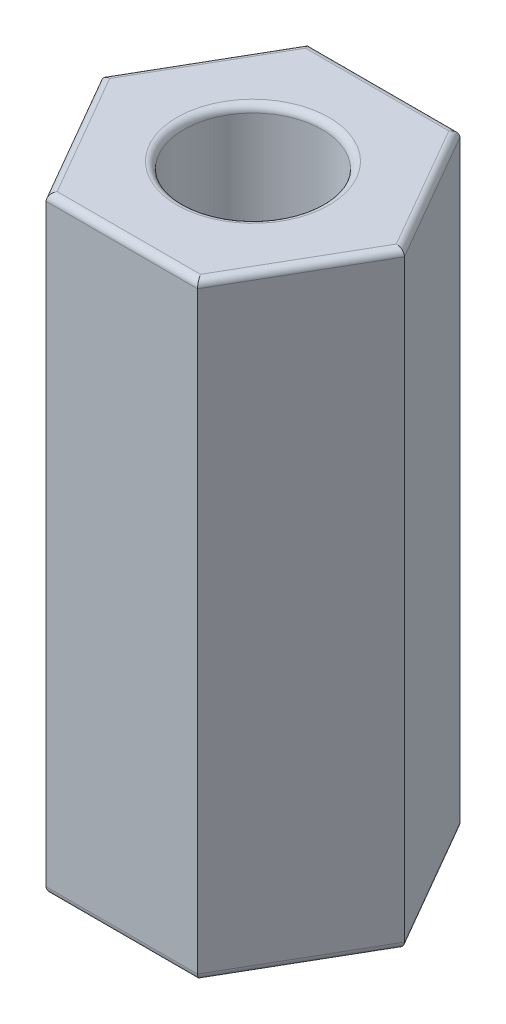
ISO-10303-21;
HEADER;
FILE_DESCRIPTION(('STEP AP214'),'2;1');
FILE_NAME('part.step','',(''),(''),'','','');
FILE_SCHEMA(('AUTOMOTIVE_DESIGN { 1 0 10303 214 1 1 1 1 }'));
ENDSEC;
DATA;
#1=APPLICATION_CONTEXT('core data for automotive mechanical design processes');
#2=APPLICATION_PROTOCOL_DEFINITION('international standard','automotive_design',2000,#1);
#3=PRODUCT_CONTEXT('',#1,'mechanical');
#4=PRODUCT('Part','Part','',(#3));
#5=PRODUCT_RELATED_PRODUCT_CATEGORY('part','',(#4));
#6=PRODUCT_DEFINITION_FORMATION('','',#4);
#7=PRODUCT_DEFINITION_CONTEXT('part definition',#1,'design');
#8=PRODUCT_DEFINITION('design','',#6,#7);
#9=PRODUCT_DEFINITION_SHAPE('','',#8);
#10=(LENGTH_UNIT() NAMED_UNIT(*) SI_UNIT(.MILLI.,.METRE.));
#11=(NAMED_UNIT(*) PLANE_ANGLE_UNIT() SI_UNIT($,.RADIAN.));
#12=(NAMED_UNIT(*) SI_UNIT($,.STERADIAN.) SOLID_ANGLE_UNIT());
#13=UNCERTAINTY_MEASURE_WITH_UNIT(LENGTH_MEASURE(1.E-05),#10,'distance_accuracy_value','');
#14=(GEOMETRIC_REPRESENTATION_CONTEXT(3) GLOBAL_UNCERTAINTY_ASSIGNED_CONTEXT((#13)) GLOBAL_UNIT_ASSIGNED_CONTEXT((#10,
#11,#12)) REPRESENTATION_CONTEXT('',''));
#15=CARTESIAN_POINT('',(0.,0.,0.));
#16=DIRECTION('',(0.,0.,1.));
#17=DIRECTION('',(1.,0.,0.));
#18=AXIS2_PLACEMENT_3D('',#15,#16,#17);
#19=CARTESIAN_POINT('',(1.37114915429844,5.5,2.37490000000001));
#20=DIRECTION('',(-0.866025403784439,0.,-0.5));
#21=DIRECTION('',(-0.5,0.,0.866025403784439));
#22=AXIS2_PLACEMENT_3D('',#19,#20,#21);
#23=PLANE('',#22);
#24=DIRECTION('',(0.,-1.,0.));
#25=VECTOR('',#24,1.);
#26=CARTESIAN_POINT('',(2.74229830859688,5.5,0.));
#27=LINE('',#26,#25);
#28=CARTESIAN_POINT('',(2.74229830859688,5.373,0.));
#29=VERTEX_POINT('',#28);
#30=CARTESIAN_POINT('',(2.74229830859688,-5.373,0.));
#31=VERTEX_POINT('',#30);
#32=EDGE_CURVE('E246',#29,#31,#27,.T.);
#33=ORIENTED_EDGE('',*,*,#32,.F.);
#34=DIRECTION('',(0.5,0.,-0.866025403784439));
#35=VECTOR('',#34,1.);
#36=CARTESIAN_POINT('',(1.37114915429844,5.373,2.37490000000001));
#37=LINE('',#36,#35);
#38=CARTESIAN_POINT('',(1.37114915429844,5.373,2.37490000000001));
#39=VERTEX_POINT('',#38);
#40=EDGE_CURVE('E178',#29,#39,#37,.F.);
#41=ORIENTED_EDGE('',*,*,#40,.T.);
#42=DIRECTION('',(0.,-1.,0.));
#43=VECTOR('',#42,1.);
#44=CARTESIAN_POINT('',(1.37114915429844,5.5,2.37490000000001));
#45=LINE('',#44,#43);
#46=CARTESIAN_POINT('',(1.37114915429844,-5.373,2.37490000000001));
#47=VERTEX_POINT('',#46);
#48=EDGE_CURVE('E208',#39,#47,#45,.T.);
#49=ORIENTED_EDGE('',*,*,#48,.T.);
#50=DIRECTION('',(0.5,0.,-0.866025403784439));
#51=VECTOR('',#50,1.);
#52=CARTESIAN_POINT('',(1.37114915429844,-5.373,2.37490000000001));
#53=LINE('',#52,#51);
#54=EDGE_CURVE('E176',#47,#31,#53,.T.);
#55=ORIENTED_EDGE('',*,*,#54,.T.);
#56=EDGE_LOOP('',(#33,#41,#49,#55));
#57=FACE_BOUND('',#56,.T.);
#58=ADVANCED_FACE('F35',(#57),#23,.F.);
#59=CARTESIAN_POINT('',(2.74229830859688,5.5,0.));
#60=DIRECTION('',(-0.866025403784439,0.,0.5));
#61=DIRECTION('',(0.5,0.,0.866025403784439));
#62=AXIS2_PLACEMENT_3D('',#59,#60,#61);
#63=PLANE('',#62);
#64=DIRECTION('',(0.,-1.,0.));
#65=VECTOR('',#64,1.);
#66=CARTESIAN_POINT('',(1.37114915429844,5.5,-2.37490000000001));
#67=LINE('',#66,#65);
#68=CARTESIAN_POINT('',(1.37114915429844,5.373,-2.37490000000001));
#69=VERTEX_POINT('',#68);
#70=CARTESIAN_POINT('',(1.37114915429844,-5.373,-2.37490000000001));
#71=VERTEX_POINT('',#70);
#72=EDGE_CURVE('E253',#69,#71,#67,.T.);
#73=ORIENTED_EDGE('',*,*,#72,.F.);
#74=DIRECTION('',(-0.5,0.,-0.866025403784439));
#75=VECTOR('',#74,1.);
#76=CARTESIAN_POINT('',(2.74229830859688,5.373,0.));
#77=LINE('',#76,#75);
#78=EDGE_CURVE('E174',#69,#29,#77,.F.);
#79=ORIENTED_EDGE('',*,*,#78,.T.);
#80=ORIENTED_EDGE('',*,*,#32,.T.);
#81=DIRECTION('',(-0.5,0.,-0.866025403784439));
#82=VECTOR('',#81,1.);
#83=CARTESIAN_POINT('',(2.74229830859688,-5.373,0.));
#84=LINE('',#83,#82);
#85=EDGE_CURVE('E171',#31,#71,#84,.T.);
#86=ORIENTED_EDGE('',*,*,#85,.T.);
#87=EDGE_LOOP('',(#73,#79,#80,#86));
#88=FACE_BOUND('',#87,.T.);
#89=ADVANCED_FACE('F250',(#88),#63,.F.);
#90=CARTESIAN_POINT('',(1.37114915429844,5.5,-2.37490000000001));
#91=DIRECTION('',(0.,0.,1.));
#92=DIRECTION('',(1.,0.,0.));
#93=AXIS2_PLACEMENT_3D('',#90,#91,#92);
#94=PLANE('',#93);
#95=DIRECTION('',(0.,-1.,0.));
#96=VECTOR('',#95,1.);
#97=CARTESIAN_POINT('',(-1.37114915429844,5.5,-2.37490000000001));
#98=LINE('',#97,#96);
#99=CARTESIAN_POINT('',(-1.37114915429844,5.373,-2.37490000000001));
#100=VERTEX_POINT('',#99);
#101=CARTESIAN_POINT('',(-1.37114915429844,-5.373,-2.37490000000001));
#102=VERTEX_POINT('',#101);
#103=EDGE_CURVE('E257',#100,#102,#98,.T.);
#104=ORIENTED_EDGE('',*,*,#103,.F.);
#105=DIRECTION('',(-1.,0.,0.));
#106=VECTOR('',#105,1.);
#107=CARTESIAN_POINT('',(1.37114915429844,5.373,-2.37490000000001));
#108=LINE('',#107,#106);
#109=EDGE_CURVE('E169',#100,#69,#108,.F.);
#110=ORIENTED_EDGE('',*,*,#109,.T.);
#111=ORIENTED_EDGE('',*,*,#72,.T.);
#112=DIRECTION('',(-1.,0.,0.));
#113=VECTOR('',#112,1.);
#114=CARTESIAN_POINT('',(1.37114915429844,-5.373,-2.37490000000001));
#115=LINE('',#114,#113);
#116=EDGE_CURVE('E167',#71,#102,#115,.T.);
#117=ORIENTED_EDGE('',*,*,#116,.T.);
#118=EDGE_LOOP('',(#104,#110,#111,#117));
#119=FACE_BOUND('',#118,.T.);
#120=ADVANCED_FACE('F313',(#119),#94,.F.);
#121=CARTESIAN_POINT('',(-1.37114915429844,5.5,-2.37490000000001));
#122=DIRECTION('',(0.866025403784438,0.,0.5));
#123=DIRECTION('',(0.5,0.,-0.866025403784439));
#124=AXIS2_PLACEMENT_3D('',#121,#122,#123);
#125=PLANE('',#124);
#126=DIRECTION('',(0.,-1.,0.));
#127=VECTOR('',#126,1.);
#128=CARTESIAN_POINT('',(-2.74229830859689,5.5,0.));
#129=LINE('',#128,#127);
#130=CARTESIAN_POINT('',(-2.74229830859689,5.373,0.));
#131=VERTEX_POINT('',#130);
#132=CARTESIAN_POINT('',(-2.74229830859689,-5.373,0.));
#133=VERTEX_POINT('',#132);
#134=EDGE_CURVE('E282',#131,#133,#129,.T.);
#135=ORIENTED_EDGE('',*,*,#134,.F.);
#136=DIRECTION('',(-0.5,0.,0.866025403784439));
#137=VECTOR('',#136,1.);
#138=CARTESIAN_POINT('',(-1.37114915429844,5.373,-2.37490000000001));
#139=LINE('',#138,#137);
#140=EDGE_CURVE('E165',#131,#100,#139,.F.);
#141=ORIENTED_EDGE('',*,*,#140,.T.);
#142=ORIENTED_EDGE('',*,*,#103,.T.);
#143=DIRECTION('',(-0.5,0.,0.866025403784439));
#144=VECTOR('',#143,1.);
#145=CARTESIAN_POINT('',(-1.37114915429844,-5.373,-2.37490000000001));
#146=LINE('',#145,#144);
#147=EDGE_CURVE('E163',#102,#133,#146,.T.);
#148=ORIENTED_EDGE('',*,*,#147,.T.);
#149=EDGE_LOOP('',(#135,#141,#142,#148));
#150=FACE_BOUND('',#149,.T.);
#151=ADVANCED_FACE('F289',(#150),#125,.F.);
#152=CARTESIAN_POINT('',(-2.74229830859689,5.5,0.));
#153=DIRECTION('',(0.866025403784439,0.,-0.5));
#154=DIRECTION('',(-0.5,0.,-0.866025403784439));
#155=AXIS2_PLACEMENT_3D('',#152,#153,#154);
#156=PLANE('',#155);
#157=DIRECTION('',(0.,-1.,0.));
#158=VECTOR('',#157,1.);
#159=CARTESIAN_POINT('',(-1.37114915429845,5.5,2.37490000000001));
#160=LINE('',#159,#158);
#161=CARTESIAN_POINT('',(-1.37114915429845,5.373,2.37490000000001));
#162=VERTEX_POINT('',#161);
#163=CARTESIAN_POINT('',(-1.37114915429845,-5.373,2.37490000000001));
#164=VERTEX_POINT('',#163);
#165=EDGE_CURVE('E280',#162,#164,#160,.T.);
#166=ORIENTED_EDGE('',*,*,#165,.F.);
#167=DIRECTION('',(0.5,0.,0.866025403784439));
#168=VECTOR('',#167,1.);
#169=CARTESIAN_POINT('',(-2.74229830859689,5.373,0.));
#170=LINE('',#169,#168);
#171=EDGE_CURVE('E161',#162,#131,#170,.F.);
#172=ORIENTED_EDGE('',*,*,#171,.T.);
#173=ORIENTED_EDGE('',*,*,#134,.T.);
#174=DIRECTION('',(0.5,0.,0.866025403784439));
#175=VECTOR('',#174,1.);
#176=CARTESIAN_POINT('',(-2.74229830859689,-5.373,0.));
#177=LINE('',#176,#175);
#178=EDGE_CURVE('E159',#133,#164,#177,.T.);
#179=ORIENTED_EDGE('',*,*,#178,.T.);
#180=EDGE_LOOP('',(#166,#172,#173,#179));
#181=FACE_BOUND('',#180,.T.);
#182=ADVANCED_FACE('F281',(#181),#156,.F.);
#183=CARTESIAN_POINT('',(-1.37114915429845,5.5,2.37490000000001));
#184=DIRECTION('',(0.,0.,-1.));
#185=DIRECTION('',(-1.,0.,0.));
#186=AXIS2_PLACEMENT_3D('',#183,#184,#185);
#187=PLANE('',#186);
#188=ORIENTED_EDGE('',*,*,#48,.F.);
#189=DIRECTION('',(1.,0.,0.));
#190=VECTOR('',#189,1.);
#191=CARTESIAN_POINT('',(-1.37114915429845,5.373,2.37490000000001));
#192=LINE('',#191,#190);
#193=EDGE_CURVE('E131',#39,#162,#192,.F.);
#194=ORIENTED_EDGE('',*,*,#193,.T.);
#195=ORIENTED_EDGE('',*,*,#165,.T.);
#196=DIRECTION('',(1.,0.,0.));
#197=VECTOR('',#196,1.);
#198=CARTESIAN_POINT('',(-1.37114915429845,-5.373,2.37490000000001));
#199=LINE('',#198,#197);
#200=EDGE_CURVE('E151',#164,#47,#199,.T.);
#201=ORIENTED_EDGE('',*,*,#200,.T.);
#202=EDGE_LOOP('',(#188,#194,#195,#201));
#203=FACE_BOUND('',#202,.T.);
#204=ADVANCED_FACE('F279',(#203),#187,.F.);
#205=CARTESIAN_POINT('',(0.,5.5,0.));
#206=DIRECTION('',(0.,1.,0.));
#207=DIRECTION('',(0.,0.,1.));
#208=AXIS2_PLACEMENT_3D('',#205,#206,#207);
#209=PLANE('',#208);
#210=DIRECTION('',(0.5,0.,0.866025403784439));
#211=VECTOR('',#210,1.);
#212=CARTESIAN_POINT('',(-1.26116392801782,5.5,2.31140000000001));
#213=LINE('',#212,#211);
#214=CARTESIAN_POINT('',(-2.59565134022273,5.5,0.));
#215=VERTEX_POINT('',#214);
#216=CARTESIAN_POINT('',(-1.29782567011136,5.5,2.24790000000001));
#217=VERTEX_POINT('',#216);
#218=EDGE_CURVE('E149',#215,#217,#213,.T.);
#219=ORIENTED_EDGE('',*,*,#218,.T.);
#220=DIRECTION('',(1.,0.,0.));
#221=VECTOR('',#220,1.);
#222=CARTESIAN_POINT('',(1.37114915429844,5.5,2.24790000000001));
#223=LINE('',#222,#221);
#224=CARTESIAN_POINT('',(1.29782567011135,5.5,2.24790000000001));
#225=VERTEX_POINT('',#224);
#226=EDGE_CURVE('E129',#217,#225,#223,.T.);
#227=ORIENTED_EDGE('',*,*,#226,.T.);
#228=DIRECTION('',(0.5,0.,-0.866025403784439));
#229=VECTOR('',#228,1.);
#230=CARTESIAN_POINT('',(2.63231308231626,5.5,-0.0634999999999998));
#231=LINE('',#230,#229);
#232=CARTESIAN_POINT('',(2.59565134022272,5.5,0.));
#233=VERTEX_POINT('',#232);
#234=EDGE_CURVE('E137',#225,#233,#231,.T.);
#235=ORIENTED_EDGE('',*,*,#234,.T.);
#236=DIRECTION('',(-0.5,0.,-0.866025403784439));
#237=VECTOR('',#236,1.);
#238=CARTESIAN_POINT('',(1.26116392801781,5.5,-2.31140000000001));
#239=LINE('',#238,#237);
#240=CARTESIAN_POINT('',(1.29782567011135,5.5,-2.24790000000001));
#241=VERTEX_POINT('',#240);
#242=EDGE_CURVE('E143',#233,#241,#239,.T.);
#243=ORIENTED_EDGE('',*,*,#242,.T.);
#244=DIRECTION('',(-1.,0.,0.));
#245=VECTOR('',#244,1.);
#246=CARTESIAN_POINT('',(-1.37114915429844,5.5,-2.24790000000001));
#247=LINE('',#246,#245);
#248=CARTESIAN_POINT('',(-1.29782567011136,5.5,-2.24790000000001));
#249=VERTEX_POINT('',#248);
#250=EDGE_CURVE('E262',#241,#249,#247,.T.);
#251=ORIENTED_EDGE('',*,*,#250,.T.);
#252=DIRECTION('',(-0.5,0.,0.866025403784439));
#253=VECTOR('',#252,1.);
#254=CARTESIAN_POINT('',(-2.63231308231627,5.5,0.0635000000000021));
#255=LINE('',#254,#253);
#256=EDGE_CURVE('E154',#249,#215,#255,.T.);
#257=ORIENTED_EDGE('',*,*,#256,.T.);
#258=EDGE_LOOP('',(#219,#227,#235,#243,#251,#257));
#259=FACE_BOUND('',#258,.T.);
#260=CARTESIAN_POINT('',(0.,5.5,0.));
#261=DIRECTION('',(0.,1.,0.));
#262=DIRECTION('',(0.,0.,1.));
#263=AXIS2_PLACEMENT_3D('',#260,#261,#262);
#264=CIRCLE('',#263,1.37699999999999);
#265=CARTESIAN_POINT('',(0.,5.5,1.37699999999999));
#266=VERTEX_POINT('',#265);
#267=EDGE_CURVE('E144',#266,#266,#264,.F.);
#268=ORIENTED_EDGE('',*,*,#267,.T.);
#269=EDGE_LOOP('',(#268));
#270=FACE_BOUND('',#269,.T.);
#271=ADVANCED_FACE('F146',(#259,#270),#209,.T.);
#272=CARTESIAN_POINT('',(0.,-5.5,0.));
#273=DIRECTION('',(0.,1.,0.));
#274=DIRECTION('',(0.,0.,1.));
#275=AXIS2_PLACEMENT_3D('',#272,#273,#274);
#276=PLANE('',#275);
#277=DIRECTION('',(-1.,0.,0.));
#278=VECTOR('',#277,1.);
#279=CARTESIAN_POINT('',(0.,-5.5,-2.24790000000001));
#280=LINE('',#279,#278);
#281=CARTESIAN_POINT('',(-1.29782567011136,-5.5,-2.24790000000001));
#282=VERTEX_POINT('',#281);
#283=CARTESIAN_POINT('',(1.29782567011135,-5.5,-2.24790000000001));
#284=VERTEX_POINT('',#283);
#285=EDGE_CURVE('E44',#282,#284,#280,.F.);
#286=ORIENTED_EDGE('',*,*,#285,.T.);
#287=DIRECTION('',(-0.5,0.,-0.866025403784439));
#288=VECTOR('',#287,1.);
#289=CARTESIAN_POINT('',(1.94673850516704,-5.5,-1.12395));
#290=LINE('',#289,#288);
#291=CARTESIAN_POINT('',(2.59565134022272,-5.5,0.));
#292=VERTEX_POINT('',#291);
#293=EDGE_CURVE('E11',#284,#292,#290,.F.);
#294=ORIENTED_EDGE('',*,*,#293,.T.);
#295=DIRECTION('',(0.5,0.,-0.866025403784439));
#296=VECTOR('',#295,1.);
#297=CARTESIAN_POINT('',(1.94673850516704,-5.5,1.12395));
#298=LINE('',#297,#296);
#299=CARTESIAN_POINT('',(1.29782567011135,-5.5,2.24790000000001));
#300=VERTEX_POINT('',#299);
#301=EDGE_CURVE('E189',#292,#300,#298,.F.);
#302=ORIENTED_EDGE('',*,*,#301,.T.);
#303=DIRECTION('',(1.,0.,0.));
#304=VECTOR('',#303,1.);
#305=CARTESIAN_POINT('',(0.,-5.5,2.24790000000001));
#306=LINE('',#305,#304);
#307=CARTESIAN_POINT('',(-1.29782567011136,-5.5,2.24790000000001));
#308=VERTEX_POINT('',#307);
#309=EDGE_CURVE('E191',#300,#308,#306,.F.);
#310=ORIENTED_EDGE('',*,*,#309,.T.);
#311=DIRECTION('',(0.5,0.,0.866025403784439));
#312=VECTOR('',#311,1.);
#313=CARTESIAN_POINT('',(-1.94673850516705,-5.5,1.12395));
#314=LINE('',#313,#312);
#315=CARTESIAN_POINT('',(-2.59565134022273,-5.5,0.));
#316=VERTEX_POINT('',#315);
#317=EDGE_CURVE('E193',#308,#316,#314,.F.);
#318=ORIENTED_EDGE('',*,*,#317,.T.);
#319=DIRECTION('',(-0.5,0.,0.866025403784439));
#320=VECTOR('',#319,1.);
#321=CARTESIAN_POINT('',(-1.94673850516705,-5.5,-1.12395));
#322=LINE('',#321,#320);
#323=EDGE_CURVE('E55',#316,#282,#322,.F.);
#324=ORIENTED_EDGE('',*,*,#323,.T.);
#325=EDGE_LOOP('',(#286,#294,#302,#310,#318,#324));
#326=FACE_BOUND('',#325,.T.);
#327=CARTESIAN_POINT('',(0.,-5.5,0.));
#328=DIRECTION('',(0.,1.,0.));
#329=DIRECTION('',(0.,0.,1.));
#330=AXIS2_PLACEMENT_3D('',#327,#328,#329);
#331=CIRCLE('',#330,1.37699999999999);
#332=CARTESIAN_POINT('',(0.,-5.5,1.37699999999999));
#333=VERTEX_POINT('',#332);
#334=EDGE_CURVE('E186',#333,#333,#331,.T.);
#335=ORIENTED_EDGE('',*,*,#334,.T.);
#336=EDGE_LOOP('',(#335));
#337=FACE_BOUND('',#336,.T.);
#338=ADVANCED_FACE('F234',(#326,#337),#276,.F.);
#339=CARTESIAN_POINT('',(0.,5.5,0.));
#340=DIRECTION('',(0.,1.,0.));
#341=DIRECTION('',(0.,0.,1.));
#342=AXIS2_PLACEMENT_3D('',#339,#340,#341);
#343=CYLINDRICAL_SURFACE('',#342,1.24999999999999);
#344=CARTESIAN_POINT('',(0.,5.373,0.));
#345=DIRECTION('',(0.,1.,0.));
#346=DIRECTION('',(0.,0.,1.));
#347=AXIS2_PLACEMENT_3D('',#344,#345,#346);
#348=CIRCLE('',#347,1.24999999999999);
#349=CARTESIAN_POINT('',(0.,5.373,1.24999999999999));
#350=VERTEX_POINT('',#349);
#351=EDGE_CURVE('E183',#350,#350,#348,.T.);
#352=ORIENTED_EDGE('',*,*,#351,.T.);
#353=EDGE_LOOP('',(#352));
#354=FACE_BOUND('',#353,.T.);
#355=CARTESIAN_POINT('',(0.,-5.373,0.));
#356=DIRECTION('',(0.,1.,0.));
#357=DIRECTION('',(0.,0.,1.));
#358=AXIS2_PLACEMENT_3D('',#355,#356,#357);
#359=CIRCLE('',#358,1.24999999999999);
#360=CARTESIAN_POINT('',(0.,-5.373,1.24999999999999));
#361=VERTEX_POINT('',#360);
#362=EDGE_CURVE('E180',#361,#361,#359,.F.);
#363=ORIENTED_EDGE('',*,*,#362,.T.);
#364=EDGE_LOOP('',(#363));
#365=FACE_BOUND('',#364,.T.);
#366=ADVANCED_FACE('F332',(#354,#365),#343,.F.);
#367=CARTESIAN_POINT('',(0.,5.373,-2.24790000000001));
#368=DIRECTION('',(1.,0.,0.));
#369=DIRECTION('',(0.,0.,-1.));
#370=AXIS2_PLACEMENT_3D('',#367,#368,#369);
#371=CYLINDRICAL_SURFACE('',#370,0.127);
#372=CARTESIAN_POINT('',(1.29782567011135,5.373,-2.24790000000001));
#373=DIRECTION('',(0.866025403784439,0.,0.5));
#374=DIRECTION('',(-0.5,0.,0.866025403784439));
#375=AXIS2_PLACEMENT_3D('',#372,#373,#374);
#376=ELLIPSE('',#375,0.146646968374165,0.127);
#377=EDGE_CURVE('E202',#69,#241,#376,.T.);
#378=ORIENTED_EDGE('',*,*,#377,.F.);
#379=ORIENTED_EDGE('',*,*,#109,.F.);
#380=CARTESIAN_POINT('',(-1.29782567011136,5.373,-2.24790000000001));
#381=DIRECTION('',(0.866025403784439,0.,-0.5));
#382=DIRECTION('',(0.5,0.,0.866025403784439));
#383=AXIS2_PLACEMENT_3D('',#380,#381,#382);
#384=ELLIPSE('',#383,0.146646968374165,0.127);
#385=EDGE_CURVE('E205',#249,#100,#384,.F.);
#386=ORIENTED_EDGE('',*,*,#385,.F.);
#387=ORIENTED_EDGE('',*,*,#250,.F.);
#388=EDGE_LOOP('',(#378,#379,#386,#387));
#389=FACE_BOUND('',#388,.T.);
#390=ADVANCED_FACE('F330',(#389),#371,.T.);
#391=CARTESIAN_POINT('',(-1.94673850516705,5.373,-1.12395));
#392=DIRECTION('',(0.5,0.,-0.866025403784439));
#393=DIRECTION('',(-0.866025403784438,0.,-0.5));
#394=AXIS2_PLACEMENT_3D('',#391,#392,#393);
#395=CYLINDRICAL_SURFACE('',#394,0.127);
#396=ORIENTED_EDGE('',*,*,#385,.T.);
#397=ORIENTED_EDGE('',*,*,#140,.F.);
#398=CARTESIAN_POINT('',(-2.59565134022273,5.373,0.));
#399=DIRECTION('',(0.,0.,-1.));
#400=DIRECTION('',(1.,0.,0.));
#401=AXIS2_PLACEMENT_3D('',#398,#399,#400);
#402=ELLIPSE('',#401,0.146646968374165,0.127);
#403=EDGE_CURVE('E199',#215,#131,#402,.F.);
#404=ORIENTED_EDGE('',*,*,#403,.F.);
#405=ORIENTED_EDGE('',*,*,#256,.F.);
#406=EDGE_LOOP('',(#396,#397,#404,#405));
#407=FACE_BOUND('',#406,.T.);
#408=ADVANCED_FACE('F269',(#407),#395,.T.);
#409=CARTESIAN_POINT('',(1.94673850516704,5.373,-1.12395));
#410=DIRECTION('',(0.5,0.,0.866025403784439));
#411=DIRECTION('',(0.866025403784439,0.,-0.5));
#412=AXIS2_PLACEMENT_3D('',#409,#410,#411);
#413=CYLINDRICAL_SURFACE('',#412,0.127);
#414=ORIENTED_EDGE('',*,*,#377,.T.);
#415=ORIENTED_EDGE('',*,*,#242,.F.);
#416=CARTESIAN_POINT('',(2.59565134022272,5.373,0.));
#417=DIRECTION('',(0.,0.,1.));
#418=DIRECTION('',(-1.,0.,0.));
#419=AXIS2_PLACEMENT_3D('',#416,#417,#418);
#420=ELLIPSE('',#419,0.146646968374165,0.127);
#421=EDGE_CURVE('E140',#29,#233,#420,.T.);
#422=ORIENTED_EDGE('',*,*,#421,.F.);
#423=ORIENTED_EDGE('',*,*,#78,.F.);
#424=EDGE_LOOP('',(#414,#415,#422,#423));
#425=FACE_BOUND('',#424,.T.);
#426=ADVANCED_FACE('F324',(#425),#413,.T.);
#427=CARTESIAN_POINT('',(-1.94673850516705,5.373,1.12395));
#428=DIRECTION('',(-0.5,0.,-0.866025403784439));
#429=DIRECTION('',(-0.866025403784439,0.,0.5));
#430=AXIS2_PLACEMENT_3D('',#427,#428,#429);
#431=CYLINDRICAL_SURFACE('',#430,0.127);
#432=ORIENTED_EDGE('',*,*,#403,.T.);
#433=ORIENTED_EDGE('',*,*,#171,.F.);
#434=CARTESIAN_POINT('',(-1.29782567011136,5.373,2.24790000000001));
#435=DIRECTION('',(-0.866025403784438,0.,-0.5));
#436=DIRECTION('',(0.5,0.,-0.866025403784439));
#437=AXIS2_PLACEMENT_3D('',#434,#435,#436);
#438=ELLIPSE('',#437,0.146646968374165,0.127);
#439=EDGE_CURVE('E134',#217,#162,#438,.F.);
#440=ORIENTED_EDGE('',*,*,#439,.F.);
#441=ORIENTED_EDGE('',*,*,#218,.F.);
#442=EDGE_LOOP('',(#432,#433,#440,#441));
#443=FACE_BOUND('',#442,.T.);
#444=ADVANCED_FACE('F272',(#443),#431,.T.);
#445=CARTESIAN_POINT('',(1.94673850516704,5.373,1.12395));
#446=DIRECTION('',(-0.5,0.,0.866025403784439));
#447=DIRECTION('',(0.866025403784439,0.,0.5));
#448=AXIS2_PLACEMENT_3D('',#445,#446,#447);
#449=CYLINDRICAL_SURFACE('',#448,0.127);
#450=ORIENTED_EDGE('',*,*,#421,.T.);
#451=ORIENTED_EDGE('',*,*,#234,.F.);
#452=CARTESIAN_POINT('',(1.29782567011135,5.373,2.24790000000001));
#453=DIRECTION('',(-0.866025403784439,0.,0.5));
#454=DIRECTION('',(0.5,0.,0.866025403784439));
#455=AXIS2_PLACEMENT_3D('',#452,#453,#454);
#456=ELLIPSE('',#455,0.146646968374165,0.127);
#457=EDGE_CURVE('E125',#39,#225,#456,.T.);
#458=ORIENTED_EDGE('',*,*,#457,.F.);
#459=ORIENTED_EDGE('',*,*,#40,.F.);
#460=EDGE_LOOP('',(#450,#451,#458,#459));
#461=FACE_BOUND('',#460,.T.);
#462=ADVANCED_FACE('F138',(#461),#449,.T.);
#463=CARTESIAN_POINT('',(0.,5.373,2.24790000000001));
#464=DIRECTION('',(-1.,0.,0.));
#465=DIRECTION('',(0.,0.,1.));
#466=AXIS2_PLACEMENT_3D('',#463,#464,#465);
#467=CYLINDRICAL_SURFACE('',#466,0.127);
#468=ORIENTED_EDGE('',*,*,#439,.T.);
#469=ORIENTED_EDGE('',*,*,#193,.F.);
#470=ORIENTED_EDGE('',*,*,#457,.T.);
#471=ORIENTED_EDGE('',*,*,#226,.F.);
#472=EDGE_LOOP('',(#468,#469,#470,#471));
#473=FACE_BOUND('',#472,.T.);
#474=ADVANCED_FACE('F127',(#473),#467,.T.);
#475=CARTESIAN_POINT('',(0.,5.373,0.));
#476=DIRECTION('',(0.,1.,0.));
#477=DIRECTION('',(0.,0.,1.));
#478=AXIS2_PLACEMENT_3D('',#475,#476,#477);
#479=TOROIDAL_SURFACE('',#478,1.37699999999999,0.127);
#480=ORIENTED_EDGE('',*,*,#267,.F.);
#481=EDGE_LOOP('',(#480));
#482=FACE_BOUND('',#481,.T.);
#483=ORIENTED_EDGE('',*,*,#351,.F.);
#484=EDGE_LOOP('',(#483));
#485=FACE_BOUND('',#484,.T.);
#486=ADVANCED_FACE('F319',(#482,#485),#479,.T.);
#487=CARTESIAN_POINT('',(-2.63231308231627,-5.373,-0.0634999999999984));
#488=DIRECTION('',(0.5,0.,0.866025403784439));
#489=DIRECTION('',(0.866025403784439,0.,-0.5));
#490=AXIS2_PLACEMENT_3D('',#487,#488,#489);
#491=CYLINDRICAL_SURFACE('',#490,0.127);
#492=CARTESIAN_POINT('',(-2.59565134022273,-5.373,0.));
#493=DIRECTION('',(0.,0.,1.));
#494=DIRECTION('',(1.,0.,0.));
#495=AXIS2_PLACEMENT_3D('',#492,#493,#494);
#496=ELLIPSE('',#495,0.146646968374165,0.127);
#497=EDGE_CURVE('E218',#316,#133,#496,.F.);
#498=ORIENTED_EDGE('',*,*,#497,.F.);
#499=ORIENTED_EDGE('',*,*,#317,.F.);
#500=CARTESIAN_POINT('',(-1.29782567011136,-5.373,2.24790000000001));
#501=DIRECTION('',(0.866025403784438,0.,0.5));
#502=DIRECTION('',(0.5,0.,-0.866025403784439));
#503=AXIS2_PLACEMENT_3D('',#500,#501,#502);
#504=ELLIPSE('',#503,0.146646968374165,0.127);
#505=EDGE_CURVE('E39',#164,#308,#504,.T.);
#506=ORIENTED_EDGE('',*,*,#505,.F.);
#507=ORIENTED_EDGE('',*,*,#178,.F.);
#508=EDGE_LOOP('',(#498,#499,#506,#507));
#509=FACE_BOUND('',#508,.T.);
#510=ADVANCED_FACE('F233',(#509),#491,.T.);
#511=CARTESIAN_POINT('',(-1.37114915429845,-5.373,2.24790000000001));
#512=DIRECTION('',(1.,0.,0.));
#513=DIRECTION('',(0.,0.,-1.));
#514=AXIS2_PLACEMENT_3D('',#511,#512,#513);
#515=CYLINDRICAL_SURFACE('',#514,0.127);
#516=ORIENTED_EDGE('',*,*,#505,.T.);
#517=ORIENTED_EDGE('',*,*,#309,.F.);
#518=CARTESIAN_POINT('',(1.29782567011135,-5.373,2.24790000000001));
#519=DIRECTION('',(0.866025403784439,0.,-0.5));
#520=DIRECTION('',(-0.5,0.,-0.866025403784439));
#521=AXIS2_PLACEMENT_3D('',#518,#519,#520);
#522=ELLIPSE('',#521,0.146646968374165,0.127);
#523=EDGE_CURVE('E216',#47,#300,#522,.T.);
#524=ORIENTED_EDGE('',*,*,#523,.F.);
#525=ORIENTED_EDGE('',*,*,#200,.F.);
#526=EDGE_LOOP('',(#516,#517,#524,#525));
#527=FACE_BOUND('',#526,.T.);
#528=ADVANCED_FACE('F228',(#527),#515,.T.);
#529=CARTESIAN_POINT('',(-1.26116392801782,-5.373,-2.31140000000001));
#530=DIRECTION('',(-0.5,0.,0.866025403784439));
#531=DIRECTION('',(0.866025403784438,0.,0.5));
#532=AXIS2_PLACEMENT_3D('',#529,#530,#531);
#533=CYLINDRICAL_SURFACE('',#532,0.127);
#534=ORIENTED_EDGE('',*,*,#497,.T.);
#535=ORIENTED_EDGE('',*,*,#147,.F.);
#536=CARTESIAN_POINT('',(-1.29782567011136,-5.373,-2.24790000000001));
#537=DIRECTION('',(-0.866025403784439,0.,0.5));
#538=DIRECTION('',(0.5,0.,0.866025403784439));
#539=AXIS2_PLACEMENT_3D('',#536,#537,#538);
#540=ELLIPSE('',#539,0.146646968374165,0.127);
#541=EDGE_CURVE('E213',#282,#102,#540,.F.);
#542=ORIENTED_EDGE('',*,*,#541,.F.);
#543=ORIENTED_EDGE('',*,*,#323,.F.);
#544=EDGE_LOOP('',(#534,#535,#542,#543));
#545=FACE_BOUND('',#544,.T.);
#546=ADVANCED_FACE('F292',(#545),#533,.T.);
#547=CARTESIAN_POINT('',(1.26116392801781,-5.373,2.31140000000001));
#548=DIRECTION('',(0.5,0.,-0.866025403784439));
#549=DIRECTION('',(-0.866025403784439,0.,-0.5));
#550=AXIS2_PLACEMENT_3D('',#547,#548,#549);
#551=CYLINDRICAL_SURFACE('',#550,0.127);
#552=ORIENTED_EDGE('',*,*,#523,.T.);
#553=ORIENTED_EDGE('',*,*,#301,.F.);
#554=CARTESIAN_POINT('',(2.59565134022272,-5.373,0.));
#555=DIRECTION('',(0.,0.,-1.));
#556=DIRECTION('',(1.,0.,0.));
#557=AXIS2_PLACEMENT_3D('',#554,#555,#556);
#558=ELLIPSE('',#557,0.146646968374165,0.127);
#559=EDGE_CURVE('E211',#31,#292,#558,.T.);
#560=ORIENTED_EDGE('',*,*,#559,.F.);
#561=ORIENTED_EDGE('',*,*,#54,.F.);
#562=EDGE_LOOP('',(#552,#553,#560,#561));
#563=FACE_BOUND('',#562,.T.);
#564=ADVANCED_FACE('F239',(#563),#551,.T.);
#565=CARTESIAN_POINT('',(1.37114915429844,-5.373,-2.24790000000001));
#566=DIRECTION('',(-1.,0.,0.));
#567=DIRECTION('',(0.,0.,1.));
#568=AXIS2_PLACEMENT_3D('',#565,#566,#567);
#569=CYLINDRICAL_SURFACE('',#568,0.127);
#570=ORIENTED_EDGE('',*,*,#541,.T.);
#571=ORIENTED_EDGE('',*,*,#116,.F.);
#572=CARTESIAN_POINT('',(1.29782567011135,-5.373,-2.24790000000001));
#573=DIRECTION('',(-0.866025403784439,0.,-0.5));
#574=DIRECTION('',(-0.5,0.,0.866025403784439));
#575=AXIS2_PLACEMENT_3D('',#572,#573,#574);
#576=ELLIPSE('',#575,0.146646968374165,0.127);
#577=EDGE_CURVE('E209',#284,#71,#576,.F.);
#578=ORIENTED_EDGE('',*,*,#577,.F.);
#579=ORIENTED_EDGE('',*,*,#285,.F.);
#580=EDGE_LOOP('',(#570,#571,#578,#579));
#581=FACE_BOUND('',#580,.T.);
#582=ADVANCED_FACE('F295',(#581),#569,.T.);
#583=CARTESIAN_POINT('',(2.63231308231626,-5.373,0.0635000000000001));
#584=DIRECTION('',(-0.5,0.,-0.866025403784439));
#585=DIRECTION('',(-0.866025403784439,0.,0.5));
#586=AXIS2_PLACEMENT_3D('',#583,#584,#585);
#587=CYLINDRICAL_SURFACE('',#586,0.127);
#588=ORIENTED_EDGE('',*,*,#559,.T.);
#589=ORIENTED_EDGE('',*,*,#293,.F.);
#590=ORIENTED_EDGE('',*,*,#577,.T.);
#591=ORIENTED_EDGE('',*,*,#85,.F.);
#592=EDGE_LOOP('',(#588,#589,#590,#591));
#593=FACE_BOUND('',#592,.T.);
#594=ADVANCED_FACE('F298',(#593),#587,.T.);
#595=CARTESIAN_POINT('',(0.,-5.373,0.));
#596=DIRECTION('',(0.,1.,0.));
#597=DIRECTION('',(0.,0.,1.));
#598=AXIS2_PLACEMENT_3D('',#595,#596,#597);
#599=TOROIDAL_SURFACE('',#598,1.37699999999999,0.127);
#600=ORIENTED_EDGE('',*,*,#362,.F.);
#601=EDGE_LOOP('',(#600));
#602=FACE_BOUND('',#601,.T.);
#603=ORIENTED_EDGE('',*,*,#334,.F.);
#604=EDGE_LOOP('',(#603));
#605=FACE_BOUND('',#604,.T.);
#606=ADVANCED_FACE('F37',(#602,#605),#599,.T.);
#607=CLOSED_SHELL('',(#58,#89,#120,#151,#182,#204,#271,#338,#366,#390,#408,#426,#444,#462,#474,
#486,#510,#528,#546,#564,#582,#594,#606));
#608=MANIFOLD_SOLID_BREP('B2',#607);
#609=ADVANCED_BREP_SHAPE_REPRESENTATION('',(#18,#608),#14);
#610=SHAPE_DEFINITION_REPRESENTATION(#9,#609);
ENDSEC;
END-ISO-10303-21;
